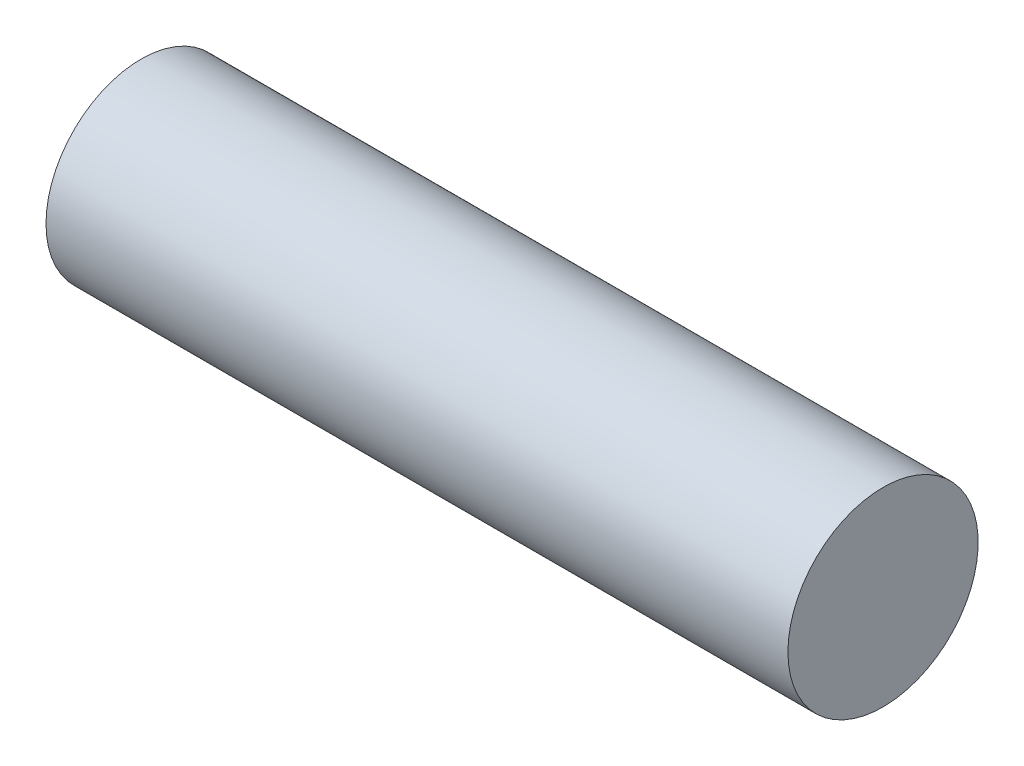
ISO-10303-21;
HEADER;
FILE_DESCRIPTION(('STEP AP214'),'2;1');
FILE_NAME('part.step','',(''),(''),'','','');
FILE_SCHEMA(('AUTOMOTIVE_DESIGN { 1 0 10303 214 1 1 1 1 }'));
ENDSEC;
DATA;
#1=APPLICATION_CONTEXT('core data for automotive mechanical design processes');
#2=APPLICATION_PROTOCOL_DEFINITION('international standard','automotive_design',2000,#1);
#3=PRODUCT_CONTEXT('',#1,'mechanical');
#4=PRODUCT('Part','Part','',(#3));
#5=PRODUCT_RELATED_PRODUCT_CATEGORY('part','',(#4));
#6=PRODUCT_DEFINITION_FORMATION('','',#4);
#7=PRODUCT_DEFINITION_CONTEXT('part definition',#1,'design');
#8=PRODUCT_DEFINITION('design','',#6,#7);
#9=PRODUCT_DEFINITION_SHAPE('','',#8);
#10=(LENGTH_UNIT() NAMED_UNIT(*) SI_UNIT(.MILLI.,.METRE.));
#11=(NAMED_UNIT(*) PLANE_ANGLE_UNIT() SI_UNIT($,.RADIAN.));
#12=(NAMED_UNIT(*) SI_UNIT($,.STERADIAN.) SOLID_ANGLE_UNIT());
#13=UNCERTAINTY_MEASURE_WITH_UNIT(LENGTH_MEASURE(1.E-05),#10,'distance_accuracy_value','');
#14=(GEOMETRIC_REPRESENTATION_CONTEXT(3) GLOBAL_UNCERTAINTY_ASSIGNED_CONTEXT((#13)) GLOBAL_UNIT_ASSIGNED_CONTEXT((#10,
#11,#12)) REPRESENTATION_CONTEXT('',''));
#15=CARTESIAN_POINT('',(0.,0.,0.));
#16=DIRECTION('',(0.,0.,1.));
#17=DIRECTION('',(1.,0.,0.));
#18=AXIS2_PLACEMENT_3D('',#15,#16,#17);
#19=CARTESIAN_POINT('',(-19.5,0.,0.));
#20=DIRECTION('',(-1.,0.,0.));
#21=DIRECTION('',(0.,0.,1.));
#22=AXIS2_PLACEMENT_3D('',#19,#20,#21);
#23=PLANE('',#22);
#24=CARTESIAN_POINT('',(-19.5,0.,0.));
#25=DIRECTION('',(-1.,0.,0.));
#26=DIRECTION('',(0.,0.,1.));
#27=AXIS2_PLACEMENT_3D('',#24,#25,#26);
#28=CIRCLE('',#27,2.1);
#29=CARTESIAN_POINT('',(-19.5,0.,2.1));
#30=VERTEX_POINT('',#29);
#31=EDGE_CURVE('E36',#30,#30,#28,.T.);
#32=ORIENTED_EDGE('',*,*,#31,.F.);
#33=EDGE_LOOP('',(#32));
#34=FACE_BOUND('',#33,.T.);
#35=CARTESIAN_POINT('',(-19.5,0.,0.));
#36=DIRECTION('',(-1.,0.,0.));
#37=DIRECTION('',(0.,0.,1.));
#38=AXIS2_PLACEMENT_3D('',#35,#36,#37);
#39=CIRCLE('',#38,5.);
#40=CARTESIAN_POINT('',(-19.5,0.,5.));
#41=VERTEX_POINT('',#40);
#42=EDGE_CURVE('E11',#41,#41,#39,.T.);
#43=ORIENTED_EDGE('',*,*,#42,.T.);
#44=EDGE_LOOP('',(#43));
#45=FACE_BOUND('',#44,.T.);
#46=ADVANCED_FACE('F17',(#34,#45),#23,.T.);
#47=CARTESIAN_POINT('',(-19.5,0.,0.));
#48=DIRECTION('',(-1.,0.,0.));
#49=DIRECTION('',(0.,0.,1.));
#50=AXIS2_PLACEMENT_3D('',#47,#48,#49);
#51=CYLINDRICAL_SURFACE('',#50,5.);
#52=CARTESIAN_POINT('',(19.5,0.,0.));
#53=DIRECTION('',(-1.,0.,0.));
#54=DIRECTION('',(0.,0.,1.));
#55=AXIS2_PLACEMENT_3D('',#52,#53,#54);
#56=CIRCLE('',#55,5.);
#57=CARTESIAN_POINT('',(19.5,0.,5.));
#58=VERTEX_POINT('',#57);
#59=EDGE_CURVE('E23',#58,#58,#56,.T.);
#60=ORIENTED_EDGE('',*,*,#59,.T.);
#61=EDGE_LOOP('',(#60));
#62=FACE_BOUND('',#61,.T.);
#63=ORIENTED_EDGE('',*,*,#42,.F.);
#64=EDGE_LOOP('',(#63));
#65=FACE_BOUND('',#64,.T.);
#66=ADVANCED_FACE('F46',(#62,#65),#51,.T.);
#67=CARTESIAN_POINT('',(19.5,-5.,0.));
#68=DIRECTION('',(1.,0.,0.));
#69=DIRECTION('',(0.,0.,-1.));
#70=AXIS2_PLACEMENT_3D('',#67,#68,#69);
#71=PLANE('',#70);
#72=ORIENTED_EDGE('',*,*,#59,.F.);
#73=EDGE_LOOP('',(#72));
#74=FACE_BOUND('',#73,.T.);
#75=ADVANCED_FACE('F30',(#74),#71,.T.);
#76=CARTESIAN_POINT('',(-9.5,0.,0.));
#77=DIRECTION('',(-1.,0.,0.));
#78=DIRECTION('',(0.,0.,1.));
#79=AXIS2_PLACEMENT_3D('',#76,#77,#78);
#80=CONICAL_SURFACE('',#79,2.1,1.02974425867665);
#81=CARTESIAN_POINT('',(-8.23819270004213,0.,0.));
#82=VERTEX_POINT('',#81);
#83=VERTEX_LOOP('',#82);
#84=FACE_BOUND('',#83,.T.);
#85=CARTESIAN_POINT('',(-9.5,0.,0.));
#86=DIRECTION('',(-1.,0.,0.));
#87=DIRECTION('',(0.,0.,1.));
#88=AXIS2_PLACEMENT_3D('',#85,#86,#87);
#89=CIRCLE('',#88,2.1);
#90=CARTESIAN_POINT('',(-9.5,0.,2.1));
#91=VERTEX_POINT('',#90);
#92=EDGE_CURVE('E34',#91,#91,#89,.T.);
#93=ORIENTED_EDGE('',*,*,#92,.T.);
#94=EDGE_LOOP('',(#93));
#95=FACE_BOUND('',#94,.T.);
#96=ADVANCED_FACE('F26',(#84,#95),#80,.F.);
#97=CARTESIAN_POINT('',(-19.5,0.,0.));
#98=DIRECTION('',(-1.,0.,0.));
#99=DIRECTION('',(0.,0.,1.));
#100=AXIS2_PLACEMENT_3D('',#97,#98,#99);
#101=CYLINDRICAL_SURFACE('',#100,2.1);
#102=ORIENTED_EDGE('',*,*,#92,.F.);
#103=EDGE_LOOP('',(#102));
#104=FACE_BOUND('',#103,.T.);
#105=ORIENTED_EDGE('',*,*,#31,.T.);
#106=EDGE_LOOP('',(#105));
#107=FACE_BOUND('',#106,.T.);
#108=ADVANCED_FACE('F29',(#104,#107),#101,.F.);
#109=CLOSED_SHELL('',(#46,#66,#75,#96,#108));
#110=MANIFOLD_SOLID_BREP('B1',#109);
#111=ADVANCED_BREP_SHAPE_REPRESENTATION('',(#18,#110),#14);
#112=SHAPE_DEFINITION_REPRESENTATION(#9,#111);
ENDSEC;
END-ISO-10303-21;
